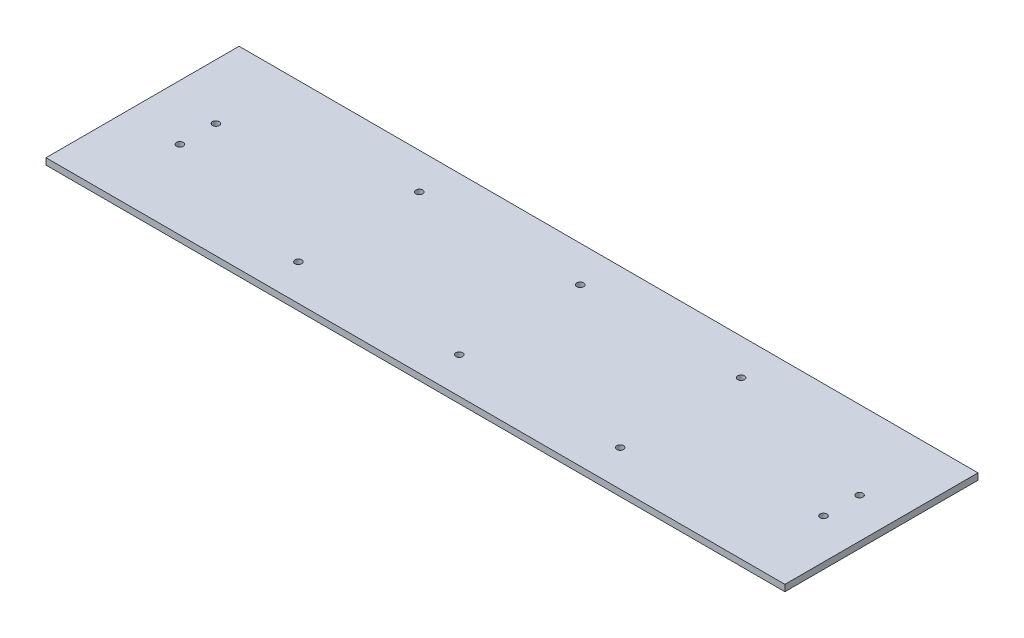
ISO-10303-21;
HEADER;
FILE_DESCRIPTION(('STEP AP214'),'2;1');
FILE_NAME('part.step','',(''),(''),'','','');
FILE_SCHEMA(('AUTOMOTIVE_DESIGN { 1 0 10303 214 1 1 1 1 }'));
ENDSEC;
DATA;
#1=APPLICATION_CONTEXT('core data for automotive mechanical design processes');
#2=APPLICATION_PROTOCOL_DEFINITION('international standard','automotive_design',2000,#1);
#3=PRODUCT_CONTEXT('',#1,'mechanical');
#4=PRODUCT('Part','Part','',(#3));
#5=PRODUCT_RELATED_PRODUCT_CATEGORY('part','',(#4));
#6=PRODUCT_DEFINITION_FORMATION('','',#4);
#7=PRODUCT_DEFINITION_CONTEXT('part definition',#1,'design');
#8=PRODUCT_DEFINITION('design','',#6,#7);
#9=PRODUCT_DEFINITION_SHAPE('','',#8);
#10=(LENGTH_UNIT() NAMED_UNIT(*) SI_UNIT(.MILLI.,.METRE.));
#11=(NAMED_UNIT(*) PLANE_ANGLE_UNIT() SI_UNIT($,.RADIAN.));
#12=(NAMED_UNIT(*) SI_UNIT($,.STERADIAN.) SOLID_ANGLE_UNIT());
#13=UNCERTAINTY_MEASURE_WITH_UNIT(LENGTH_MEASURE(1.E-05),#10,'distance_accuracy_value','');
#14=(GEOMETRIC_REPRESENTATION_CONTEXT(3) GLOBAL_UNCERTAINTY_ASSIGNED_CONTEXT((#13)) GLOBAL_UNIT_ASSIGNED_CONTEXT((#10,
#11,#12)) REPRESENTATION_CONTEXT('',''));
#15=CARTESIAN_POINT('',(0.,0.,0.));
#16=DIRECTION('',(0.,0.,1.));
#17=DIRECTION('',(1.,0.,0.));
#18=AXIS2_PLACEMENT_3D('',#15,#16,#17);
#19=CARTESIAN_POINT('',(0.,5.,0.));
#20=DIRECTION('',(0.,-1.,0.));
#21=DIRECTION('',(0.,0.,-1.));
#22=AXIS2_PLACEMENT_3D('',#19,#20,#21);
#23=PLANE('',#22);
#24=DIRECTION('',(1.,0.,0.));
#25=VECTOR('',#24,1.);
#26=CARTESIAN_POINT('',(574.,5.,0.));
#27=LINE('',#26,#25);
#28=CARTESIAN_POINT('',(0.,5.,0.));
#29=VERTEX_POINT('',#28);
#30=CARTESIAN_POINT('',(574.,5.,0.));
#31=VERTEX_POINT('',#30);
#32=EDGE_CURVE('E86',#29,#31,#27,.T.);
#33=ORIENTED_EDGE('',*,*,#32,.T.);
#34=DIRECTION('',(0.,0.,-1.));
#35=VECTOR('',#34,1.);
#36=CARTESIAN_POINT('',(574.,5.,-150.));
#37=LINE('',#36,#35);
#38=CARTESIAN_POINT('',(574.,5.,-150.));
#39=VERTEX_POINT('',#38);
#40=EDGE_CURVE('E81',#31,#39,#37,.T.);
#41=ORIENTED_EDGE('',*,*,#40,.T.);
#42=DIRECTION('',(-1.,0.,0.));
#43=VECTOR('',#42,1.);
#44=CARTESIAN_POINT('',(0.,5.,-150.));
#45=LINE('',#44,#43);
#46=CARTESIAN_POINT('',(0.,5.,-150.));
#47=VERTEX_POINT('',#46);
#48=EDGE_CURVE('E84',#39,#47,#45,.T.);
#49=ORIENTED_EDGE('',*,*,#48,.T.);
#50=DIRECTION('',(0.,0.,1.));
#51=VECTOR('',#50,1.);
#52=CARTESIAN_POINT('',(0.,5.,0.));
#53=LINE('',#52,#51);
#54=EDGE_CURVE('E51',#47,#29,#53,.T.);
#55=ORIENTED_EDGE('',*,*,#54,.T.);
#56=EDGE_LOOP('',(#33,#41,#49,#55));
#57=FACE_BOUND('',#56,.T.);
#58=CARTESIAN_POINT('',(43.,5.,-61.));
#59=DIRECTION('',(0.,1.,0.));
#60=DIRECTION('',(0.,0.,1.));
#61=AXIS2_PLACEMENT_3D('',#58,#59,#60);
#62=CIRCLE('',#61,2.65);
#63=CARTESIAN_POINT('',(43.,5.,-58.35));
#64=VERTEX_POINT('',#63);
#65=EDGE_CURVE('E101',#64,#64,#62,.T.);
#66=ORIENTED_EDGE('',*,*,#65,.F.);
#67=EDGE_LOOP('',(#66));
#68=FACE_BOUND('',#67,.T.);
#69=CARTESIAN_POINT('',(168.,5.,-28.));
#70=DIRECTION('',(0.,1.,0.));
#71=DIRECTION('',(0.,0.,1.));
#72=AXIS2_PLACEMENT_3D('',#69,#70,#71);
#73=CIRCLE('',#72,2.65000000000001);
#74=CARTESIAN_POINT('',(168.,5.,-25.35));
#75=VERTEX_POINT('',#74);
#76=EDGE_CURVE('E116',#75,#75,#73,.T.);
#77=ORIENTED_EDGE('',*,*,#76,.F.);
#78=EDGE_LOOP('',(#77));
#79=FACE_BOUND('',#78,.T.);
#80=CARTESIAN_POINT('',(293.,5.,-28.));
#81=DIRECTION('',(0.,1.,0.));
#82=DIRECTION('',(0.,0.,1.));
#83=AXIS2_PLACEMENT_3D('',#80,#81,#82);
#84=CIRCLE('',#83,2.64999999999999);
#85=CARTESIAN_POINT('',(293.,5.,-25.35));
#86=VERTEX_POINT('',#85);
#87=EDGE_CURVE('E122',#86,#86,#84,.T.);
#88=ORIENTED_EDGE('',*,*,#87,.F.);
#89=EDGE_LOOP('',(#88));
#90=FACE_BOUND('',#89,.T.);
#91=CARTESIAN_POINT('',(418.,5.,-28.));
#92=DIRECTION('',(0.,1.,0.));
#93=DIRECTION('',(0.,0.,1.));
#94=AXIS2_PLACEMENT_3D('',#91,#92,#93);
#95=CIRCLE('',#94,2.64999999999999);
#96=CARTESIAN_POINT('',(418.,5.,-25.35));
#97=VERTEX_POINT('',#96);
#98=EDGE_CURVE('E128',#97,#97,#95,.T.);
#99=ORIENTED_EDGE('',*,*,#98,.F.);
#100=EDGE_LOOP('',(#99));
#101=FACE_BOUND('',#100,.T.);
#102=CARTESIAN_POINT('',(543.,5.,-61.));
#103=DIRECTION('',(0.,1.,0.));
#104=DIRECTION('',(0.,0.,1.));
#105=AXIS2_PLACEMENT_3D('',#102,#103,#104);
#106=CIRCLE('',#105,2.64999999999998);
#107=CARTESIAN_POINT('',(543.,5.,-58.35));
#108=VERTEX_POINT('',#107);
#109=EDGE_CURVE('E134',#108,#108,#106,.T.);
#110=ORIENTED_EDGE('',*,*,#109,.F.);
#111=EDGE_LOOP('',(#110));
#112=FACE_BOUND('',#111,.T.);
#113=CARTESIAN_POINT('',(543.,5.,-89.));
#114=DIRECTION('',(0.,1.,0.));
#115=DIRECTION('',(0.,0.,-1.));
#116=AXIS2_PLACEMENT_3D('',#113,#114,#115);
#117=CIRCLE('',#116,2.64999999999998);
#118=CARTESIAN_POINT('',(543.,5.,-91.65));
#119=VERTEX_POINT('',#118);
#120=EDGE_CURVE('E140',#119,#119,#117,.T.);
#121=ORIENTED_EDGE('',*,*,#120,.F.);
#122=EDGE_LOOP('',(#121));
#123=FACE_BOUND('',#122,.T.);
#124=CARTESIAN_POINT('',(418.,5.,-122.));
#125=DIRECTION('',(0.,1.,0.));
#126=DIRECTION('',(0.,0.,-1.));
#127=AXIS2_PLACEMENT_3D('',#124,#125,#126);
#128=CIRCLE('',#127,2.64999999999999);
#129=CARTESIAN_POINT('',(418.,5.,-124.65));
#130=VERTEX_POINT('',#129);
#131=EDGE_CURVE('E146',#130,#130,#128,.T.);
#132=ORIENTED_EDGE('',*,*,#131,.F.);
#133=EDGE_LOOP('',(#132));
#134=FACE_BOUND('',#133,.T.);
#135=CARTESIAN_POINT('',(293.,5.,-122.));
#136=DIRECTION('',(0.,1.,0.));
#137=DIRECTION('',(0.,0.,-1.));
#138=AXIS2_PLACEMENT_3D('',#135,#136,#137);
#139=CIRCLE('',#138,2.64999999999999);
#140=CARTESIAN_POINT('',(293.,5.,-124.65));
#141=VERTEX_POINT('',#140);
#142=EDGE_CURVE('E152',#141,#141,#139,.T.);
#143=ORIENTED_EDGE('',*,*,#142,.F.);
#144=EDGE_LOOP('',(#143));
#145=FACE_BOUND('',#144,.T.);
#146=CARTESIAN_POINT('',(168.,5.,-122.));
#147=DIRECTION('',(0.,1.,0.));
#148=DIRECTION('',(0.,0.,-1.));
#149=AXIS2_PLACEMENT_3D('',#146,#147,#148);
#150=CIRCLE('',#149,2.65000000000001);
#151=CARTESIAN_POINT('',(168.,5.,-124.65));
#152=VERTEX_POINT('',#151);
#153=EDGE_CURVE('E158',#152,#152,#150,.T.);
#154=ORIENTED_EDGE('',*,*,#153,.F.);
#155=EDGE_LOOP('',(#154));
#156=FACE_BOUND('',#155,.T.);
#157=CARTESIAN_POINT('',(43.,5.,-89.));
#158=DIRECTION('',(0.,1.,0.));
#159=DIRECTION('',(0.,0.,-1.));
#160=AXIS2_PLACEMENT_3D('',#157,#158,#159);
#161=CIRCLE('',#160,2.65);
#162=CARTESIAN_POINT('',(43.,5.,-91.65));
#163=VERTEX_POINT('',#162);
#164=EDGE_CURVE('E164',#163,#163,#161,.T.);
#165=ORIENTED_EDGE('',*,*,#164,.F.);
#166=EDGE_LOOP('',(#165));
#167=FACE_BOUND('',#166,.T.);
#168=ADVANCED_FACE('F34',(#57,#68,#79,#90,#101,#112,#123,#134,#145,#156,#167),#23,.F.);
#169=CARTESIAN_POINT('',(0.,0.,0.));
#170=DIRECTION('',(0.,-1.,0.));
#171=DIRECTION('',(0.,0.,-1.));
#172=AXIS2_PLACEMENT_3D('',#169,#170,#171);
#173=PLANE('',#172);
#174=CARTESIAN_POINT('',(168.,0.,-122.));
#175=DIRECTION('',(0.,1.,0.));
#176=DIRECTION('',(0.,0.,-1.));
#177=AXIS2_PLACEMENT_3D('',#174,#175,#176);
#178=CIRCLE('',#177,2.65000000000001);
#179=CARTESIAN_POINT('',(168.,0.,-124.65));
#180=VERTEX_POINT('',#179);
#181=EDGE_CURVE('E161',#180,#180,#178,.T.);
#182=ORIENTED_EDGE('',*,*,#181,.T.);
#183=EDGE_LOOP('',(#182));
#184=FACE_BOUND('',#183,.T.);
#185=CARTESIAN_POINT('',(418.,0.,-122.));
#186=DIRECTION('',(0.,1.,0.));
#187=DIRECTION('',(0.,0.,-1.));
#188=AXIS2_PLACEMENT_3D('',#185,#186,#187);
#189=CIRCLE('',#188,2.64999999999999);
#190=CARTESIAN_POINT('',(418.,0.,-124.65));
#191=VERTEX_POINT('',#190);
#192=EDGE_CURVE('E149',#191,#191,#189,.T.);
#193=ORIENTED_EDGE('',*,*,#192,.T.);
#194=EDGE_LOOP('',(#193));
#195=FACE_BOUND('',#194,.T.);
#196=CARTESIAN_POINT('',(543.,0.,-61.));
#197=DIRECTION('',(0.,1.,0.));
#198=DIRECTION('',(0.,0.,1.));
#199=AXIS2_PLACEMENT_3D('',#196,#197,#198);
#200=CIRCLE('',#199,2.64999999999998);
#201=CARTESIAN_POINT('',(543.,0.,-58.35));
#202=VERTEX_POINT('',#201);
#203=EDGE_CURVE('E137',#202,#202,#200,.T.);
#204=ORIENTED_EDGE('',*,*,#203,.T.);
#205=EDGE_LOOP('',(#204));
#206=FACE_BOUND('',#205,.T.);
#207=CARTESIAN_POINT('',(293.,0.,-28.));
#208=DIRECTION('',(0.,1.,0.));
#209=DIRECTION('',(0.,0.,1.));
#210=AXIS2_PLACEMENT_3D('',#207,#208,#209);
#211=CIRCLE('',#210,2.64999999999999);
#212=CARTESIAN_POINT('',(293.,0.,-25.35));
#213=VERTEX_POINT('',#212);
#214=EDGE_CURVE('E125',#213,#213,#211,.T.);
#215=ORIENTED_EDGE('',*,*,#214,.T.);
#216=EDGE_LOOP('',(#215));
#217=FACE_BOUND('',#216,.T.);
#218=CARTESIAN_POINT('',(43.,0.,-61.));
#219=DIRECTION('',(0.,1.,0.));
#220=DIRECTION('',(0.,0.,1.));
#221=AXIS2_PLACEMENT_3D('',#218,#219,#220);
#222=CIRCLE('',#221,2.65);
#223=CARTESIAN_POINT('',(43.,0.,-58.35));
#224=VERTEX_POINT('',#223);
#225=EDGE_CURVE('E113',#224,#224,#222,.T.);
#226=ORIENTED_EDGE('',*,*,#225,.T.);
#227=EDGE_LOOP('',(#226));
#228=FACE_BOUND('',#227,.T.);
#229=DIRECTION('',(1.,0.,0.));
#230=VECTOR('',#229,1.);
#231=CARTESIAN_POINT('',(574.,0.,0.));
#232=LINE('',#231,#230);
#233=CARTESIAN_POINT('',(0.,0.,0.));
#234=VERTEX_POINT('',#233);
#235=CARTESIAN_POINT('',(574.,0.,0.));
#236=VERTEX_POINT('',#235);
#237=EDGE_CURVE('E98',#234,#236,#232,.T.);
#238=ORIENTED_EDGE('',*,*,#237,.F.);
#239=DIRECTION('',(0.,0.,1.));
#240=VECTOR('',#239,1.);
#241=CARTESIAN_POINT('',(0.,0.,0.));
#242=LINE('',#241,#240);
#243=CARTESIAN_POINT('',(0.,0.,-150.));
#244=VERTEX_POINT('',#243);
#245=EDGE_CURVE('E74',#244,#234,#242,.T.);
#246=ORIENTED_EDGE('',*,*,#245,.F.);
#247=DIRECTION('',(-1.,0.,0.));
#248=VECTOR('',#247,1.);
#249=CARTESIAN_POINT('',(0.,0.,-150.));
#250=LINE('',#249,#248);
#251=CARTESIAN_POINT('',(574.,0.,-150.));
#252=VERTEX_POINT('',#251);
#253=EDGE_CURVE('E68',#252,#244,#250,.T.);
#254=ORIENTED_EDGE('',*,*,#253,.F.);
#255=DIRECTION('',(0.,0.,-1.));
#256=VECTOR('',#255,1.);
#257=CARTESIAN_POINT('',(574.,0.,-150.));
#258=LINE('',#257,#256);
#259=EDGE_CURVE('E90',#236,#252,#258,.T.);
#260=ORIENTED_EDGE('',*,*,#259,.F.);
#261=EDGE_LOOP('',(#238,#246,#254,#260));
#262=FACE_BOUND('',#261,.T.);
#263=CARTESIAN_POINT('',(168.,0.,-28.));
#264=DIRECTION('',(0.,1.,0.));
#265=DIRECTION('',(0.,0.,1.));
#266=AXIS2_PLACEMENT_3D('',#263,#264,#265);
#267=CIRCLE('',#266,2.65000000000001);
#268=CARTESIAN_POINT('',(168.,0.,-25.35));
#269=VERTEX_POINT('',#268);
#270=EDGE_CURVE('E119',#269,#269,#267,.T.);
#271=ORIENTED_EDGE('',*,*,#270,.T.);
#272=EDGE_LOOP('',(#271));
#273=FACE_BOUND('',#272,.T.);
#274=CARTESIAN_POINT('',(418.,0.,-28.));
#275=DIRECTION('',(0.,1.,0.));
#276=DIRECTION('',(0.,0.,1.));
#277=AXIS2_PLACEMENT_3D('',#274,#275,#276);
#278=CIRCLE('',#277,2.64999999999999);
#279=CARTESIAN_POINT('',(418.,0.,-25.35));
#280=VERTEX_POINT('',#279);
#281=EDGE_CURVE('E131',#280,#280,#278,.T.);
#282=ORIENTED_EDGE('',*,*,#281,.T.);
#283=EDGE_LOOP('',(#282));
#284=FACE_BOUND('',#283,.T.);
#285=CARTESIAN_POINT('',(543.,0.,-89.));
#286=DIRECTION('',(0.,1.,0.));
#287=DIRECTION('',(0.,0.,-1.));
#288=AXIS2_PLACEMENT_3D('',#285,#286,#287);
#289=CIRCLE('',#288,2.64999999999998);
#290=CARTESIAN_POINT('',(543.,0.,-91.65));
#291=VERTEX_POINT('',#290);
#292=EDGE_CURVE('E143',#291,#291,#289,.T.);
#293=ORIENTED_EDGE('',*,*,#292,.T.);
#294=EDGE_LOOP('',(#293));
#295=FACE_BOUND('',#294,.T.);
#296=CARTESIAN_POINT('',(293.,0.,-122.));
#297=DIRECTION('',(0.,1.,0.));
#298=DIRECTION('',(0.,0.,-1.));
#299=AXIS2_PLACEMENT_3D('',#296,#297,#298);
#300=CIRCLE('',#299,2.64999999999999);
#301=CARTESIAN_POINT('',(293.,0.,-124.65));
#302=VERTEX_POINT('',#301);
#303=EDGE_CURVE('E155',#302,#302,#300,.T.);
#304=ORIENTED_EDGE('',*,*,#303,.T.);
#305=EDGE_LOOP('',(#304));
#306=FACE_BOUND('',#305,.T.);
#307=CARTESIAN_POINT('',(43.,0.,-89.));
#308=DIRECTION('',(0.,1.,0.));
#309=DIRECTION('',(0.,0.,-1.));
#310=AXIS2_PLACEMENT_3D('',#307,#308,#309);
#311=CIRCLE('',#310,2.65);
#312=CARTESIAN_POINT('',(43.,0.,-91.65));
#313=VERTEX_POINT('',#312);
#314=EDGE_CURVE('E167',#313,#313,#311,.T.);
#315=ORIENTED_EDGE('',*,*,#314,.T.);
#316=EDGE_LOOP('',(#315));
#317=FACE_BOUND('',#316,.T.);
#318=ADVANCED_FACE('F109',(#184,#195,#206,#217,#228,#262,#273,#284,#295,#306,#317),#173,.T.);
#319=CARTESIAN_POINT('',(574.,5.,0.));
#320=DIRECTION('',(0.,0.,-1.));
#321=DIRECTION('',(-1.,0.,0.));
#322=AXIS2_PLACEMENT_3D('',#319,#320,#321);
#323=PLANE('',#322);
#324=ORIENTED_EDGE('',*,*,#237,.T.);
#325=DIRECTION('',(0.,-1.,0.));
#326=VECTOR('',#325,1.);
#327=CARTESIAN_POINT('',(574.,5.,0.));
#328=LINE('',#327,#326);
#329=EDGE_CURVE('E11',#31,#236,#328,.T.);
#330=ORIENTED_EDGE('',*,*,#329,.F.);
#331=ORIENTED_EDGE('',*,*,#32,.F.);
#332=DIRECTION('',(0.,-1.,0.));
#333=VECTOR('',#332,1.);
#334=CARTESIAN_POINT('',(0.,5.,0.));
#335=LINE('',#334,#333);
#336=EDGE_CURVE('E94',#29,#234,#335,.T.);
#337=ORIENTED_EDGE('',*,*,#336,.T.);
#338=EDGE_LOOP('',(#324,#330,#331,#337));
#339=FACE_BOUND('',#338,.T.);
#340=ADVANCED_FACE('F36',(#339),#323,.F.);
#341=CARTESIAN_POINT('',(574.,5.,-150.));
#342=DIRECTION('',(-1.,0.,0.));
#343=DIRECTION('',(0.,0.,1.));
#344=AXIS2_PLACEMENT_3D('',#341,#342,#343);
#345=PLANE('',#344);
#346=ORIENTED_EDGE('',*,*,#259,.T.);
#347=DIRECTION('',(0.,-1.,0.));
#348=VECTOR('',#347,1.);
#349=CARTESIAN_POINT('',(574.,5.,-150.));
#350=LINE('',#349,#348);
#351=EDGE_CURVE('E43',#39,#252,#350,.T.);
#352=ORIENTED_EDGE('',*,*,#351,.F.);
#353=ORIENTED_EDGE('',*,*,#40,.F.);
#354=ORIENTED_EDGE('',*,*,#329,.T.);
#355=EDGE_LOOP('',(#346,#352,#353,#354));
#356=FACE_BOUND('',#355,.T.);
#357=ADVANCED_FACE('F89',(#356),#345,.F.);
#358=CARTESIAN_POINT('',(0.,5.,-150.));
#359=DIRECTION('',(0.,0.,1.));
#360=DIRECTION('',(1.,0.,0.));
#361=AXIS2_PLACEMENT_3D('',#358,#359,#360);
#362=PLANE('',#361);
#363=ORIENTED_EDGE('',*,*,#253,.T.);
#364=DIRECTION('',(0.,-1.,0.));
#365=VECTOR('',#364,1.);
#366=CARTESIAN_POINT('',(0.,5.,-150.));
#367=LINE('',#366,#365);
#368=EDGE_CURVE('E91',#47,#244,#367,.T.);
#369=ORIENTED_EDGE('',*,*,#368,.F.);
#370=ORIENTED_EDGE('',*,*,#48,.F.);
#371=ORIENTED_EDGE('',*,*,#351,.T.);
#372=EDGE_LOOP('',(#363,#369,#370,#371));
#373=FACE_BOUND('',#372,.T.);
#374=ADVANCED_FACE('F92',(#373),#362,.F.);
#375=CARTESIAN_POINT('',(0.,5.,0.));
#376=DIRECTION('',(1.,0.,0.));
#377=DIRECTION('',(0.,0.,-1.));
#378=AXIS2_PLACEMENT_3D('',#375,#376,#377);
#379=PLANE('',#378);
#380=ORIENTED_EDGE('',*,*,#245,.T.);
#381=ORIENTED_EDGE('',*,*,#336,.F.);
#382=ORIENTED_EDGE('',*,*,#54,.F.);
#383=ORIENTED_EDGE('',*,*,#368,.T.);
#384=EDGE_LOOP('',(#380,#381,#382,#383));
#385=FACE_BOUND('',#384,.T.);
#386=ADVANCED_FACE('F106',(#385),#379,.F.);
#387=CARTESIAN_POINT('',(43.,5.,-61.));
#388=DIRECTION('',(0.,-1.,0.));
#389=DIRECTION('',(0.,0.,-1.));
#390=AXIS2_PLACEMENT_3D('',#387,#388,#389);
#391=CYLINDRICAL_SURFACE('',#390,2.65);
#392=ORIENTED_EDGE('',*,*,#65,.T.);
#393=EDGE_LOOP('',(#392));
#394=FACE_BOUND('',#393,.T.);
#395=ORIENTED_EDGE('',*,*,#225,.F.);
#396=EDGE_LOOP('',(#395));
#397=FACE_BOUND('',#396,.T.);
#398=ADVANCED_FACE('F184',(#394,#397),#391,.F.);
#399=CARTESIAN_POINT('',(168.,5.,-28.));
#400=DIRECTION('',(0.,-1.,0.));
#401=DIRECTION('',(0.,0.,-1.));
#402=AXIS2_PLACEMENT_3D('',#399,#400,#401);
#403=CYLINDRICAL_SURFACE('',#402,2.65000000000001);
#404=ORIENTED_EDGE('',*,*,#76,.T.);
#405=EDGE_LOOP('',(#404));
#406=FACE_BOUND('',#405,.T.);
#407=ORIENTED_EDGE('',*,*,#270,.F.);
#408=EDGE_LOOP('',(#407));
#409=FACE_BOUND('',#408,.T.);
#410=ADVANCED_FACE('F232',(#406,#409),#403,.F.);
#411=CARTESIAN_POINT('',(293.,5.,-28.));
#412=DIRECTION('',(0.,-1.,0.));
#413=DIRECTION('',(0.,0.,-1.));
#414=AXIS2_PLACEMENT_3D('',#411,#412,#413);
#415=CYLINDRICAL_SURFACE('',#414,2.64999999999999);
#416=ORIENTED_EDGE('',*,*,#87,.T.);
#417=EDGE_LOOP('',(#416));
#418=FACE_BOUND('',#417,.T.);
#419=ORIENTED_EDGE('',*,*,#214,.F.);
#420=EDGE_LOOP('',(#419));
#421=FACE_BOUND('',#420,.T.);
#422=ADVANCED_FACE('F240',(#418,#421),#415,.F.);
#423=CARTESIAN_POINT('',(418.,5.,-28.));
#424=DIRECTION('',(0.,-1.,0.));
#425=DIRECTION('',(0.,0.,-1.));
#426=AXIS2_PLACEMENT_3D('',#423,#424,#425);
#427=CYLINDRICAL_SURFACE('',#426,2.64999999999999);
#428=ORIENTED_EDGE('',*,*,#98,.T.);
#429=EDGE_LOOP('',(#428));
#430=FACE_BOUND('',#429,.T.);
#431=ORIENTED_EDGE('',*,*,#281,.F.);
#432=EDGE_LOOP('',(#431));
#433=FACE_BOUND('',#432,.T.);
#434=ADVANCED_FACE('F248',(#430,#433),#427,.F.);
#435=CARTESIAN_POINT('',(543.,5.,-61.));
#436=DIRECTION('',(0.,-1.,0.));
#437=DIRECTION('',(0.,0.,-1.));
#438=AXIS2_PLACEMENT_3D('',#435,#436,#437);
#439=CYLINDRICAL_SURFACE('',#438,2.64999999999998);
#440=ORIENTED_EDGE('',*,*,#109,.T.);
#441=EDGE_LOOP('',(#440));
#442=FACE_BOUND('',#441,.T.);
#443=ORIENTED_EDGE('',*,*,#203,.F.);
#444=EDGE_LOOP('',(#443));
#445=FACE_BOUND('',#444,.T.);
#446=ADVANCED_FACE('F257',(#442,#445),#439,.F.);
#447=CARTESIAN_POINT('',(543.,5.,-89.));
#448=DIRECTION('',(0.,-1.,0.));
#449=DIRECTION('',(0.,0.,-1.));
#450=AXIS2_PLACEMENT_3D('',#447,#448,#449);
#451=CYLINDRICAL_SURFACE('',#450,2.64999999999998);
#452=ORIENTED_EDGE('',*,*,#120,.T.);
#453=EDGE_LOOP('',(#452));
#454=FACE_BOUND('',#453,.T.);
#455=ORIENTED_EDGE('',*,*,#292,.F.);
#456=EDGE_LOOP('',(#455));
#457=FACE_BOUND('',#456,.T.);
#458=ADVANCED_FACE('F266',(#454,#457),#451,.F.);
#459=CARTESIAN_POINT('',(418.,5.,-122.));
#460=DIRECTION('',(0.,-1.,0.));
#461=DIRECTION('',(0.,0.,-1.));
#462=AXIS2_PLACEMENT_3D('',#459,#460,#461);
#463=CYLINDRICAL_SURFACE('',#462,2.64999999999999);
#464=ORIENTED_EDGE('',*,*,#131,.T.);
#465=EDGE_LOOP('',(#464));
#466=FACE_BOUND('',#465,.T.);
#467=ORIENTED_EDGE('',*,*,#192,.F.);
#468=EDGE_LOOP('',(#467));
#469=FACE_BOUND('',#468,.T.);
#470=ADVANCED_FACE('F275',(#466,#469),#463,.F.);
#471=CARTESIAN_POINT('',(293.,5.,-122.));
#472=DIRECTION('',(0.,-1.,0.));
#473=DIRECTION('',(0.,0.,-1.));
#474=AXIS2_PLACEMENT_3D('',#471,#472,#473);
#475=CYLINDRICAL_SURFACE('',#474,2.64999999999999);
#476=ORIENTED_EDGE('',*,*,#142,.T.);
#477=EDGE_LOOP('',(#476));
#478=FACE_BOUND('',#477,.T.);
#479=ORIENTED_EDGE('',*,*,#303,.F.);
#480=EDGE_LOOP('',(#479));
#481=FACE_BOUND('',#480,.T.);
#482=ADVANCED_FACE('F284',(#478,#481),#475,.F.);
#483=CARTESIAN_POINT('',(168.,5.,-122.));
#484=DIRECTION('',(0.,-1.,0.));
#485=DIRECTION('',(0.,0.,-1.));
#486=AXIS2_PLACEMENT_3D('',#483,#484,#485);
#487=CYLINDRICAL_SURFACE('',#486,2.65000000000001);
#488=ORIENTED_EDGE('',*,*,#153,.T.);
#489=EDGE_LOOP('',(#488));
#490=FACE_BOUND('',#489,.T.);
#491=ORIENTED_EDGE('',*,*,#181,.F.);
#492=EDGE_LOOP('',(#491));
#493=FACE_BOUND('',#492,.T.);
#494=ADVANCED_FACE('F293',(#490,#493),#487,.F.);
#495=CARTESIAN_POINT('',(43.,5.,-89.));
#496=DIRECTION('',(0.,-1.,0.));
#497=DIRECTION('',(0.,0.,-1.));
#498=AXIS2_PLACEMENT_3D('',#495,#496,#497);
#499=CYLINDRICAL_SURFACE('',#498,2.65);
#500=ORIENTED_EDGE('',*,*,#164,.T.);
#501=EDGE_LOOP('',(#500));
#502=FACE_BOUND('',#501,.T.);
#503=ORIENTED_EDGE('',*,*,#314,.F.);
#504=EDGE_LOOP('',(#503));
#505=FACE_BOUND('',#504,.T.);
#506=ADVANCED_FACE('F173',(#502,#505),#499,.F.);
#507=CLOSED_SHELL('',(#168,#318,#340,#357,#374,#386,#398,#410,#422,#434,#446,#458,#470,#482,
#494,#506));
#508=MANIFOLD_SOLID_BREP('B2',#507);
#509=ADVANCED_BREP_SHAPE_REPRESENTATION('',(#18,#508),#14);
#510=SHAPE_DEFINITION_REPRESENTATION(#9,#509);
ENDSEC;
END-ISO-10303-21;
